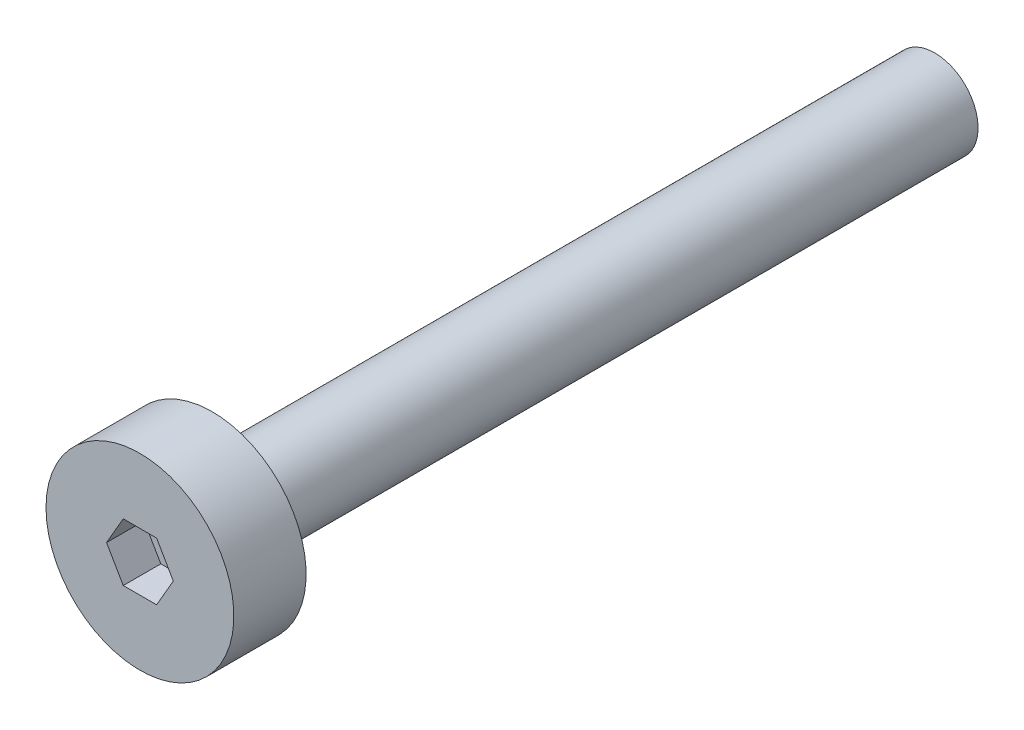
ISO-10303-21;
HEADER;
FILE_DESCRIPTION(('STEP AP214'),'2;1');
FILE_NAME('part.step','',(''),(''),'','','');
FILE_SCHEMA(('AUTOMOTIVE_DESIGN { 1 0 10303 214 1 1 1 1 }'));
ENDSEC;
DATA;
#1=APPLICATION_CONTEXT('core data for automotive mechanical design processes');
#2=APPLICATION_PROTOCOL_DEFINITION('international standard','automotive_design',2000,#1);
#3=PRODUCT_CONTEXT('',#1,'mechanical');
#4=PRODUCT('Part','Part','',(#3));
#5=PRODUCT_RELATED_PRODUCT_CATEGORY('part','',(#4));
#6=PRODUCT_DEFINITION_FORMATION('','',#4);
#7=PRODUCT_DEFINITION_CONTEXT('part definition',#1,'design');
#8=PRODUCT_DEFINITION('design','',#6,#7);
#9=PRODUCT_DEFINITION_SHAPE('','',#8);
#10=(LENGTH_UNIT() NAMED_UNIT(*) SI_UNIT(.MILLI.,.METRE.));
#11=(NAMED_UNIT(*) PLANE_ANGLE_UNIT() SI_UNIT($,.RADIAN.));
#12=(NAMED_UNIT(*) SI_UNIT($,.STERADIAN.) SOLID_ANGLE_UNIT());
#13=UNCERTAINTY_MEASURE_WITH_UNIT(LENGTH_MEASURE(1.E-05),#10,'distance_accuracy_value','');
#14=(GEOMETRIC_REPRESENTATION_CONTEXT(3) GLOBAL_UNCERTAINTY_ASSIGNED_CONTEXT((#13)) GLOBAL_UNIT_ASSIGNED_CONTEXT((#10,
#11,#12)) REPRESENTATION_CONTEXT('',''));
#15=CARTESIAN_POINT('',(0.,0.,0.));
#16=DIRECTION('',(0.,0.,1.));
#17=DIRECTION('',(1.,0.,0.));
#18=AXIS2_PLACEMENT_3D('',#15,#16,#17);
#19=CARTESIAN_POINT('',(0.,0.,1.2));
#20=DIRECTION('',(0.,0.,1.));
#21=DIRECTION('',(1.,0.,0.));
#22=AXIS2_PLACEMENT_3D('',#19,#20,#21);
#23=PLANE('',#22);
#24=DIRECTION('',(-0.50000000000019,0.866025403784329,0.));
#25=VECTOR('',#24,1.);
#26=CARTESIAN_POINT('',(1.154700538379,0.,1.2));
#27=LINE('',#26,#25);
#28=CARTESIAN_POINT('',(1.154700538379,0.,1.2));
#29=VERTEX_POINT('',#28);
#30=CARTESIAN_POINT('',(0.57735026919,1.,1.2));
#31=VERTEX_POINT('',#30);
#32=EDGE_CURVE('E10',#29,#31,#27,.T.);
#33=ORIENTED_EDGE('',*,*,#32,.T.);
#34=DIRECTION('',(-1.,0.,0.));
#35=VECTOR('',#34,1.);
#36=CARTESIAN_POINT('',(0.57735026919,1.,1.2));
#37=LINE('',#36,#35);
#38=CARTESIAN_POINT('',(-0.57735026919,1.,1.2));
#39=VERTEX_POINT('',#38);
#40=EDGE_CURVE('E104',#31,#39,#37,.T.);
#41=ORIENTED_EDGE('',*,*,#40,.T.);
#42=DIRECTION('',(-0.50000000000019,-0.866025403784329,0.));
#43=VECTOR('',#42,1.);
#44=CARTESIAN_POINT('',(-0.57735026919,1.,1.2));
#45=LINE('',#44,#43);
#46=CARTESIAN_POINT('',(-1.154700538379,0.,1.2));
#47=VERTEX_POINT('',#46);
#48=EDGE_CURVE('E145',#39,#47,#45,.T.);
#49=ORIENTED_EDGE('',*,*,#48,.T.);
#50=DIRECTION('',(0.50000000000019,-0.866025403784329,0.));
#51=VECTOR('',#50,1.);
#52=CARTESIAN_POINT('',(-1.154700538379,0.,1.2));
#53=LINE('',#52,#51);
#54=CARTESIAN_POINT('',(-0.57735026919,-1.,1.2));
#55=VERTEX_POINT('',#54);
#56=EDGE_CURVE('E230',#47,#55,#53,.T.);
#57=ORIENTED_EDGE('',*,*,#56,.T.);
#58=DIRECTION('',(1.,0.,0.));
#59=VECTOR('',#58,1.);
#60=CARTESIAN_POINT('',(-0.57735026919,-1.,1.2));
#61=LINE('',#60,#59);
#62=CARTESIAN_POINT('',(0.57735026919,-1.,1.2));
#63=VERTEX_POINT('',#62);
#64=EDGE_CURVE('E167',#55,#63,#61,.T.);
#65=ORIENTED_EDGE('',*,*,#64,.T.);
#66=DIRECTION('',(0.50000000000019,0.866025403784329,0.));
#67=VECTOR('',#66,1.);
#68=CARTESIAN_POINT('',(0.57735026919,-1.,1.2));
#69=LINE('',#68,#67);
#70=EDGE_CURVE('E133',#63,#29,#69,.T.);
#71=ORIENTED_EDGE('',*,*,#70,.T.);
#72=EDGE_LOOP('',(#33,#41,#49,#57,#65,#71));
#73=FACE_BOUND('',#72,.T.);
#74=ADVANCED_FACE('F15',(#73),#23,.T.);
#75=CARTESIAN_POINT('',(0.,0.,-25.));
#76=DIRECTION('',(0.,0.,-1.));
#77=DIRECTION('',(0.,-1.,0.));
#78=AXIS2_PLACEMENT_3D('',#75,#76,#77);
#79=PLANE('',#78);
#80=CARTESIAN_POINT('',(0.,0.,-25.));
#81=DIRECTION('',(0.,0.,-1.));
#82=DIRECTION('',(-1.,0.,0.));
#83=AXIS2_PLACEMENT_3D('',#80,#81,#82);
#84=CIRCLE('',#83,1.5);
#85=CARTESIAN_POINT('',(-1.5,0.,-25.));
#86=VERTEX_POINT('',#85);
#87=EDGE_CURVE('E139',#86,#86,#84,.T.);
#88=ORIENTED_EDGE('',*,*,#87,.T.);
#89=EDGE_LOOP('',(#88));
#90=FACE_BOUND('',#89,.T.);
#91=ADVANCED_FACE('F186',(#90),#79,.T.);
#92=CARTESIAN_POINT('',(1.154700538379,0.,1.2));
#93=DIRECTION('',(-0.866025403784329,-0.50000000000019,0.));
#94=DIRECTION('',(-0.50000000000019,0.866025403784329,0.));
#95=AXIS2_PLACEMENT_3D('',#92,#93,#94);
#96=PLANE('',#95);
#97=ORIENTED_EDGE('',*,*,#32,.F.);
#98=DIRECTION('',(0.,0.,1.));
#99=VECTOR('',#98,1.);
#100=CARTESIAN_POINT('',(1.154700538379,0.,1.2));
#101=LINE('',#100,#99);
#102=CARTESIAN_POINT('',(1.154700538379,0.,2.5));
#103=VERTEX_POINT('',#102);
#104=EDGE_CURVE('E91',#29,#103,#101,.T.);
#105=ORIENTED_EDGE('',*,*,#104,.T.);
#106=DIRECTION('',(-0.50000000000019,0.866025403784329,0.));
#107=VECTOR('',#106,1.);
#108=CARTESIAN_POINT('',(1.010362971082,0.25,2.5));
#109=LINE('',#108,#107);
#110=CARTESIAN_POINT('',(0.57735026919,1.,2.5));
#111=VERTEX_POINT('',#110);
#112=EDGE_CURVE('E108',#103,#111,#109,.T.);
#113=ORIENTED_EDGE('',*,*,#112,.T.);
#114=DIRECTION('',(0.,0.,1.));
#115=VECTOR('',#114,1.);
#116=CARTESIAN_POINT('',(0.57735026919,1.,1.2));
#117=LINE('',#116,#115);
#118=EDGE_CURVE('E26',#31,#111,#117,.T.);
#119=ORIENTED_EDGE('',*,*,#118,.F.);
#120=EDGE_LOOP('',(#97,#105,#113,#119));
#121=FACE_BOUND('',#120,.T.);
#122=ADVANCED_FACE('F109',(#121),#96,.T.);
#123=CARTESIAN_POINT('',(0.57735026919,1.,1.2));
#124=DIRECTION('',(0.,-1.,0.));
#125=DIRECTION('',(-1.,0.,0.));
#126=AXIS2_PLACEMENT_3D('',#123,#124,#125);
#127=PLANE('',#126);
#128=ORIENTED_EDGE('',*,*,#40,.F.);
#129=ORIENTED_EDGE('',*,*,#118,.T.);
#130=DIRECTION('',(-1.,0.,0.));
#131=VECTOR('',#130,1.);
#132=CARTESIAN_POINT('',(0.288675134595,1.,2.5));
#133=LINE('',#132,#131);
#134=CARTESIAN_POINT('',(-0.57735026919,1.,2.5));
#135=VERTEX_POINT('',#134);
#136=EDGE_CURVE('E102',#111,#135,#133,.T.);
#137=ORIENTED_EDGE('',*,*,#136,.T.);
#138=DIRECTION('',(0.,0.,1.));
#139=VECTOR('',#138,1.);
#140=CARTESIAN_POINT('',(-0.57735026919,1.,1.2));
#141=LINE('',#140,#139);
#142=EDGE_CURVE('E142',#39,#135,#141,.T.);
#143=ORIENTED_EDGE('',*,*,#142,.F.);
#144=EDGE_LOOP('',(#128,#129,#137,#143));
#145=FACE_BOUND('',#144,.T.);
#146=ADVANCED_FACE('F99',(#145),#127,.T.);
#147=CARTESIAN_POINT('',(-0.57735026919,1.,1.2));
#148=DIRECTION('',(0.866025403784329,-0.50000000000019,0.));
#149=DIRECTION('',(0.,0.,-1.));
#150=AXIS2_PLACEMENT_3D('',#147,#148,#149);
#151=PLANE('',#150);
#152=ORIENTED_EDGE('',*,*,#48,.F.);
#153=ORIENTED_EDGE('',*,*,#142,.T.);
#154=DIRECTION('',(-0.50000000000019,-0.866025403784329,0.));
#155=VECTOR('',#154,1.);
#156=CARTESIAN_POINT('',(-0.721687836487,0.75,2.5));
#157=LINE('',#156,#155);
#158=CARTESIAN_POINT('',(-1.154700538379,0.,2.5));
#159=VERTEX_POINT('',#158);
#160=EDGE_CURVE('E120',#135,#159,#157,.T.);
#161=ORIENTED_EDGE('',*,*,#160,.T.);
#162=DIRECTION('',(0.,0.,1.));
#163=VECTOR('',#162,1.);
#164=CARTESIAN_POINT('',(-1.154700538379,0.,1.2));
#165=LINE('',#164,#163);
#166=EDGE_CURVE('E19',#47,#159,#165,.T.);
#167=ORIENTED_EDGE('',*,*,#166,.F.);
#168=EDGE_LOOP('',(#152,#153,#161,#167));
#169=FACE_BOUND('',#168,.T.);
#170=ADVANCED_FACE('F211',(#169),#151,.T.);
#171=CARTESIAN_POINT('',(-1.154700538379,0.,1.2));
#172=DIRECTION('',(0.866025403784329,0.50000000000019,0.));
#173=DIRECTION('',(0.,0.,-1.));
#174=AXIS2_PLACEMENT_3D('',#171,#172,#173);
#175=PLANE('',#174);
#176=ORIENTED_EDGE('',*,*,#56,.F.);
#177=ORIENTED_EDGE('',*,*,#166,.T.);
#178=DIRECTION('',(0.50000000000019,-0.866025403784329,0.));
#179=VECTOR('',#178,1.);
#180=CARTESIAN_POINT('',(-1.010362971082,-0.25,2.5));
#181=LINE('',#180,#179);
#182=CARTESIAN_POINT('',(-0.57735026919,-1.,2.5));
#183=VERTEX_POINT('',#182);
#184=EDGE_CURVE('E127',#159,#183,#181,.T.);
#185=ORIENTED_EDGE('',*,*,#184,.T.);
#186=DIRECTION('',(0.,0.,1.));
#187=VECTOR('',#186,1.);
#188=CARTESIAN_POINT('',(-0.57735026919,-1.,1.2));
#189=LINE('',#188,#187);
#190=EDGE_CURVE('E168',#55,#183,#189,.T.);
#191=ORIENTED_EDGE('',*,*,#190,.F.);
#192=EDGE_LOOP('',(#176,#177,#185,#191));
#193=FACE_BOUND('',#192,.T.);
#194=ADVANCED_FACE('F222',(#193),#175,.T.);
#195=CARTESIAN_POINT('',(-0.57735026919,-1.,1.2));
#196=DIRECTION('',(0.,1.,0.));
#197=DIRECTION('',(1.,0.,0.));
#198=AXIS2_PLACEMENT_3D('',#195,#196,#197);
#199=PLANE('',#198);
#200=ORIENTED_EDGE('',*,*,#64,.F.);
#201=ORIENTED_EDGE('',*,*,#190,.T.);
#202=DIRECTION('',(1.,0.,0.));
#203=VECTOR('',#202,1.);
#204=CARTESIAN_POINT('',(-0.288675134595,-1.,2.5));
#205=LINE('',#204,#203);
#206=CARTESIAN_POINT('',(0.57735026919,-1.,2.5));
#207=VERTEX_POINT('',#206);
#208=EDGE_CURVE('E131',#183,#207,#205,.T.);
#209=ORIENTED_EDGE('',*,*,#208,.T.);
#210=DIRECTION('',(0.,0.,1.));
#211=VECTOR('',#210,1.);
#212=CARTESIAN_POINT('',(0.57735026919,-1.,1.2));
#213=LINE('',#212,#211);
#214=EDGE_CURVE('E135',#63,#207,#213,.T.);
#215=ORIENTED_EDGE('',*,*,#214,.F.);
#216=EDGE_LOOP('',(#200,#201,#209,#215));
#217=FACE_BOUND('',#216,.T.);
#218=ADVANCED_FACE('F217',(#217),#199,.T.);
#219=CARTESIAN_POINT('',(0.57735026919,-1.,1.2));
#220=DIRECTION('',(-0.866025403784329,0.50000000000019,0.));
#221=DIRECTION('',(0.,0.,1.));
#222=AXIS2_PLACEMENT_3D('',#219,#220,#221);
#223=PLANE('',#222);
#224=ORIENTED_EDGE('',*,*,#70,.F.);
#225=ORIENTED_EDGE('',*,*,#214,.T.);
#226=DIRECTION('',(0.50000000000019,0.866025403784329,0.));
#227=VECTOR('',#226,1.);
#228=CARTESIAN_POINT('',(0.721687836487,-0.75,2.5));
#229=LINE('',#228,#227);
#230=EDGE_CURVE('E113',#207,#103,#229,.T.);
#231=ORIENTED_EDGE('',*,*,#230,.T.);
#232=ORIENTED_EDGE('',*,*,#104,.F.);
#233=EDGE_LOOP('',(#224,#225,#231,#232));
#234=FACE_BOUND('',#233,.T.);
#235=ADVANCED_FACE('F17',(#234),#223,.T.);
#236=CARTESIAN_POINT('',(0.,0.,0.));
#237=DIRECTION('',(0.,0.,-1.));
#238=DIRECTION('',(-1.,0.,0.));
#239=AXIS2_PLACEMENT_3D('',#236,#237,#238);
#240=CYLINDRICAL_SURFACE('',#239,1.5);
#241=ORIENTED_EDGE('',*,*,#87,.F.);
#242=DIRECTION('',(0.,0.,-1.));
#243=VECTOR('',#242,1.);
#244=CARTESIAN_POINT('',(-1.5,0.,0.));
#245=LINE('',#244,#243);
#246=CARTESIAN_POINT('',(-1.5,0.,0.));
#247=VERTEX_POINT('',#246);
#248=EDGE_CURVE('E136',#247,#86,#245,.T.);
#249=ORIENTED_EDGE('',*,*,#248,.F.);
#250=CARTESIAN_POINT('',(0.,0.,0.));
#251=DIRECTION('',(0.,0.,-1.));
#252=DIRECTION('',(-1.,0.,0.));
#253=AXIS2_PLACEMENT_3D('',#250,#251,#252);
#254=CIRCLE('',#253,1.5);
#255=EDGE_CURVE('E162',#247,#247,#254,.T.);
#256=ORIENTED_EDGE('',*,*,#255,.T.);
#257=ORIENTED_EDGE('',*,*,#248,.T.);
#258=EDGE_LOOP('',(#241,#249,#256,#257));
#259=FACE_BOUND('',#258,.T.);
#260=ADVANCED_FACE('F189',(#259),#240,.T.);
#261=CARTESIAN_POINT('',(0.,0.,2.5));
#262=DIRECTION('',(0.,0.,-1.));
#263=DIRECTION('',(0.,-1.,0.));
#264=AXIS2_PLACEMENT_3D('',#261,#262,#263);
#265=PLANE('',#264);
#266=ORIENTED_EDGE('',*,*,#208,.F.);
#267=ORIENTED_EDGE('',*,*,#184,.F.);
#268=ORIENTED_EDGE('',*,*,#160,.F.);
#269=ORIENTED_EDGE('',*,*,#136,.F.);
#270=ORIENTED_EDGE('',*,*,#112,.F.);
#271=ORIENTED_EDGE('',*,*,#230,.F.);
#272=EDGE_LOOP('',(#266,#267,#268,#269,#270,#271));
#273=FACE_BOUND('',#272,.T.);
#274=CARTESIAN_POINT('',(0.,0.,2.5));
#275=DIRECTION('',(0.,0.,-1.));
#276=DIRECTION('',(-1.,0.,0.));
#277=AXIS2_PLACEMENT_3D('',#274,#275,#276);
#278=CIRCLE('',#277,3.25);
#279=CARTESIAN_POINT('',(-3.25,0.,2.5));
#280=VERTEX_POINT('',#279);
#281=EDGE_CURVE('E154',#280,#280,#278,.T.);
#282=ORIENTED_EDGE('',*,*,#281,.F.);
#283=EDGE_LOOP('',(#282));
#284=FACE_BOUND('',#283,.T.);
#285=ADVANCED_FACE('F116',(#273,#284),#265,.F.);
#286=CARTESIAN_POINT('',(0.,0.,0.));
#287=DIRECTION('',(0.,0.,-1.));
#288=DIRECTION('',(0.,-1.,0.));
#289=AXIS2_PLACEMENT_3D('',#286,#287,#288);
#290=PLANE('',#289);
#291=ORIENTED_EDGE('',*,*,#255,.F.);
#292=EDGE_LOOP('',(#291));
#293=FACE_BOUND('',#292,.T.);
#294=CARTESIAN_POINT('',(0.,0.,0.));
#295=DIRECTION('',(0.,0.,-1.));
#296=DIRECTION('',(-1.,0.,0.));
#297=AXIS2_PLACEMENT_3D('',#294,#295,#296);
#298=CIRCLE('',#297,3.25);
#299=CARTESIAN_POINT('',(-3.25,0.,0.));
#300=VERTEX_POINT('',#299);
#301=EDGE_CURVE('E146',#300,#300,#298,.T.);
#302=ORIENTED_EDGE('',*,*,#301,.T.);
#303=EDGE_LOOP('',(#302));
#304=FACE_BOUND('',#303,.T.);
#305=ADVANCED_FACE('F192',(#293,#304),#290,.T.);
#306=CARTESIAN_POINT('',(0.,0.,2.5));
#307=DIRECTION('',(0.,0.,-1.));
#308=DIRECTION('',(-1.,0.,0.));
#309=AXIS2_PLACEMENT_3D('',#306,#307,#308);
#310=CYLINDRICAL_SURFACE('',#309,3.25);
#311=ORIENTED_EDGE('',*,*,#301,.F.);
#312=DIRECTION('',(0.,0.,-1.));
#313=VECTOR('',#312,1.);
#314=CARTESIAN_POINT('',(-3.25,0.,2.5));
#315=LINE('',#314,#313);
#316=EDGE_CURVE('E149',#280,#300,#315,.T.);
#317=ORIENTED_EDGE('',*,*,#316,.F.);
#318=ORIENTED_EDGE('',*,*,#281,.T.);
#319=ORIENTED_EDGE('',*,*,#316,.T.);
#320=EDGE_LOOP('',(#311,#317,#318,#319));
#321=FACE_BOUND('',#320,.T.);
#322=ADVANCED_FACE('F194',(#321),#310,.T.);
#323=CLOSED_SHELL('',(#74,#91,#122,#146,#170,#194,#218,#235,#260,#285,#305,#322));
#324=MANIFOLD_SOLID_BREP('B1',#323);
#325=ADVANCED_BREP_SHAPE_REPRESENTATION('',(#18,#324),#14);
#326=SHAPE_DEFINITION_REPRESENTATION(#9,#325);
ENDSEC;
END-ISO-10303-21;
